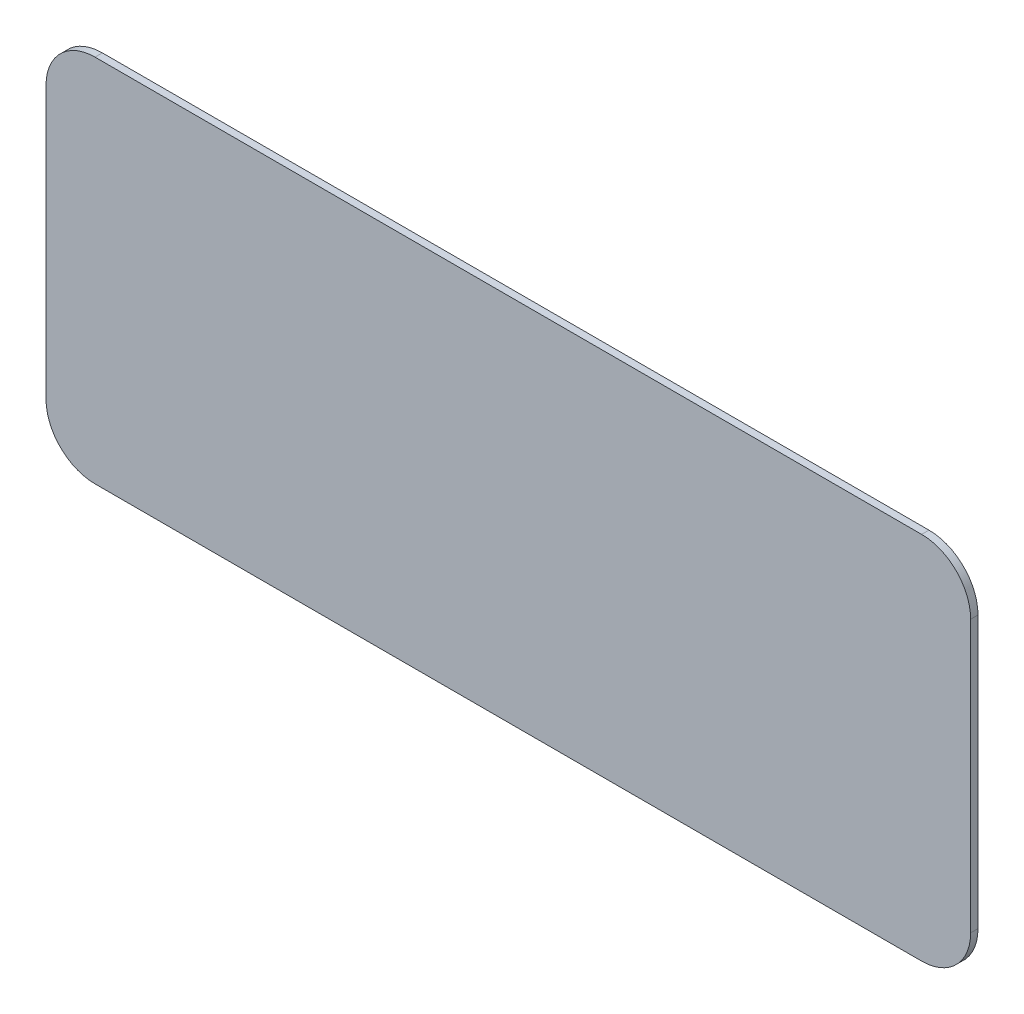
ISO-10303-21;
HEADER;
FILE_DESCRIPTION(('STEP AP214'),'2;1');
FILE_NAME('part.step','',(''),(''),'','','');
FILE_SCHEMA(('AUTOMOTIVE_DESIGN { 1 0 10303 214 1 1 1 1 }'));
ENDSEC;
DATA;
#1=APPLICATION_CONTEXT('core data for automotive mechanical design processes');
#2=APPLICATION_PROTOCOL_DEFINITION('international standard','automotive_design',2000,#1);
#3=PRODUCT_CONTEXT('',#1,'mechanical');
#4=PRODUCT('Part','Part','',(#3));
#5=PRODUCT_RELATED_PRODUCT_CATEGORY('part','',(#4));
#6=PRODUCT_DEFINITION_FORMATION('','',#4);
#7=PRODUCT_DEFINITION_CONTEXT('part definition',#1,'design');
#8=PRODUCT_DEFINITION('design','',#6,#7);
#9=PRODUCT_DEFINITION_SHAPE('','',#8);
#10=(LENGTH_UNIT() NAMED_UNIT(*) SI_UNIT(.MILLI.,.METRE.));
#11=(NAMED_UNIT(*) PLANE_ANGLE_UNIT() SI_UNIT($,.RADIAN.));
#12=(NAMED_UNIT(*) SI_UNIT($,.STERADIAN.) SOLID_ANGLE_UNIT());
#13=UNCERTAINTY_MEASURE_WITH_UNIT(LENGTH_MEASURE(1.E-05),#10,'distance_accuracy_value','');
#14=(GEOMETRIC_REPRESENTATION_CONTEXT(3) GLOBAL_UNCERTAINTY_ASSIGNED_CONTEXT((#13)) GLOBAL_UNIT_ASSIGNED_CONTEXT((#10,
#11,#12)) REPRESENTATION_CONTEXT('',''));
#15=CARTESIAN_POINT('',(0.,0.,0.));
#16=DIRECTION('',(0.,0.,1.));
#17=DIRECTION('',(1.,0.,0.));
#18=AXIS2_PLACEMENT_3D('',#15,#16,#17);
#19=CARTESIAN_POINT('',(74.93,110.871,3.));
#20=DIRECTION('',(0.,0.,-1.));
#21=DIRECTION('',(-1.,0.,0.));
#22=AXIS2_PLACEMENT_3D('',#19,#20,#21);
#23=CYLINDRICAL_SURFACE('',#22,20.);
#24=CARTESIAN_POINT('',(74.93,110.871,0.));
#25=DIRECTION('',(0.,0.,1.));
#26=DIRECTION('',(1.,0.,0.));
#27=AXIS2_PLACEMENT_3D('',#24,#25,#26);
#28=CIRCLE('',#27,20.);
#29=CARTESIAN_POINT('',(94.93,110.871,0.));
#30=VERTEX_POINT('',#29);
#31=CARTESIAN_POINT('',(74.9299999999999,130.871,0.));
#32=VERTEX_POINT('',#31);
#33=EDGE_CURVE('E128',#30,#32,#28,.T.);
#34=ORIENTED_EDGE('',*,*,#33,.T.);
#35=DIRECTION('',(0.,0.,-1.));
#36=VECTOR('',#35,1.);
#37=CARTESIAN_POINT('',(74.9299999999999,130.871,3.));
#38=LINE('',#37,#36);
#39=CARTESIAN_POINT('',(74.9299999999999,130.871,3.));
#40=VERTEX_POINT('',#39);
#41=EDGE_CURVE('E11',#40,#32,#38,.T.);
#42=ORIENTED_EDGE('',*,*,#41,.F.);
#43=CARTESIAN_POINT('',(74.93,110.871,3.));
#44=DIRECTION('',(0.,0.,1.));
#45=DIRECTION('',(1.,0.,0.));
#46=AXIS2_PLACEMENT_3D('',#43,#44,#45);
#47=CIRCLE('',#46,20.);
#48=CARTESIAN_POINT('',(94.93,110.871,3.));
#49=VERTEX_POINT('',#48);
#50=EDGE_CURVE('E142',#49,#40,#47,.T.);
#51=ORIENTED_EDGE('',*,*,#50,.F.);
#52=DIRECTION('',(0.,0.,-1.));
#53=VECTOR('',#52,1.);
#54=CARTESIAN_POINT('',(94.93,110.871,3.));
#55=LINE('',#54,#53);
#56=EDGE_CURVE('E124',#49,#30,#55,.T.);
#57=ORIENTED_EDGE('',*,*,#56,.T.);
#58=EDGE_LOOP('',(#34,#42,#51,#57));
#59=FACE_BOUND('',#58,.T.);
#60=ADVANCED_FACE('F32',(#59),#23,.T.);
#61=CARTESIAN_POINT('',(74.9299999999999,130.871,3.));
#62=DIRECTION('',(0.,-1.,0.));
#63=DIRECTION('',(0.,0.,-1.));
#64=AXIS2_PLACEMENT_3D('',#61,#62,#63);
#65=PLANE('',#64);
#66=DIRECTION('',(-1.,0.,0.));
#67=VECTOR('',#66,1.);
#68=CARTESIAN_POINT('',(74.9299999999999,130.871,0.));
#69=LINE('',#68,#67);
#70=CARTESIAN_POINT('',(-262.531032337169,130.871,0.));
#71=VERTEX_POINT('',#70);
#72=EDGE_CURVE('E131',#32,#71,#69,.T.);
#73=ORIENTED_EDGE('',*,*,#72,.T.);
#74=DIRECTION('',(0.,0.,-1.));
#75=VECTOR('',#74,1.);
#76=CARTESIAN_POINT('',(-262.531032337169,130.871,3.));
#77=LINE('',#76,#75);
#78=CARTESIAN_POINT('',(-262.531032337169,130.871,3.));
#79=VERTEX_POINT('',#78);
#80=EDGE_CURVE('E40',#79,#71,#77,.T.);
#81=ORIENTED_EDGE('',*,*,#80,.F.);
#82=DIRECTION('',(-1.,0.,0.));
#83=VECTOR('',#82,1.);
#84=CARTESIAN_POINT('',(74.9299999999999,130.871,3.));
#85=LINE('',#84,#83);
#86=EDGE_CURVE('E91',#40,#79,#85,.T.);
#87=ORIENTED_EDGE('',*,*,#86,.F.);
#88=ORIENTED_EDGE('',*,*,#41,.T.);
#89=EDGE_LOOP('',(#73,#81,#87,#88));
#90=FACE_BOUND('',#89,.T.);
#91=ADVANCED_FACE('F177',(#90),#65,.F.);
#92=CARTESIAN_POINT('',(-262.531032337169,110.871,3.));
#93=DIRECTION('',(0.,0.,-1.));
#94=DIRECTION('',(-1.,0.,0.));
#95=AXIS2_PLACEMENT_3D('',#92,#93,#94);
#96=CYLINDRICAL_SURFACE('',#95,20.);
#97=CARTESIAN_POINT('',(-262.531032337169,110.871,0.));
#98=DIRECTION('',(0.,0.,1.));
#99=DIRECTION('',(1.,0.,0.));
#100=AXIS2_PLACEMENT_3D('',#97,#98,#99);
#101=CIRCLE('',#100,20.);
#102=CARTESIAN_POINT('',(-282.531032337169,110.871,0.));
#103=VERTEX_POINT('',#102);
#104=EDGE_CURVE('E133',#71,#103,#101,.T.);
#105=ORIENTED_EDGE('',*,*,#104,.T.);
#106=DIRECTION('',(0.,0.,-1.));
#107=VECTOR('',#106,1.);
#108=CARTESIAN_POINT('',(-282.531032337169,110.871,3.));
#109=LINE('',#108,#107);
#110=CARTESIAN_POINT('',(-282.531032337169,110.871,3.));
#111=VERTEX_POINT('',#110);
#112=EDGE_CURVE('E149',#111,#103,#109,.T.);
#113=ORIENTED_EDGE('',*,*,#112,.F.);
#114=CARTESIAN_POINT('',(-262.531032337169,110.871,3.));
#115=DIRECTION('',(0.,0.,1.));
#116=DIRECTION('',(1.,0.,0.));
#117=AXIS2_PLACEMENT_3D('',#114,#115,#116);
#118=CIRCLE('',#117,20.);
#119=EDGE_CURVE('E157',#79,#111,#118,.T.);
#120=ORIENTED_EDGE('',*,*,#119,.F.);
#121=ORIENTED_EDGE('',*,*,#80,.T.);
#122=EDGE_LOOP('',(#105,#113,#120,#121));
#123=FACE_BOUND('',#122,.T.);
#124=ADVANCED_FACE('F155',(#123),#96,.T.);
#125=CARTESIAN_POINT('',(-282.531032337169,110.871,3.));
#126=DIRECTION('',(1.,0.,0.));
#127=DIRECTION('',(0.,0.,-1.));
#128=AXIS2_PLACEMENT_3D('',#125,#126,#127);
#129=PLANE('',#128);
#130=DIRECTION('',(0.,-1.,0.));
#131=VECTOR('',#130,1.);
#132=CARTESIAN_POINT('',(-282.531032337169,110.871,0.));
#133=LINE('',#132,#131);
#134=CARTESIAN_POINT('',(-282.531032337169,0.,0.));
#135=VERTEX_POINT('',#134);
#136=EDGE_CURVE('E135',#103,#135,#133,.T.);
#137=ORIENTED_EDGE('',*,*,#136,.T.);
#138=DIRECTION('',(0.,0.,-1.));
#139=VECTOR('',#138,1.);
#140=CARTESIAN_POINT('',(-282.531032337169,0.,3.));
#141=LINE('',#140,#139);
#142=CARTESIAN_POINT('',(-282.531032337169,0.,3.));
#143=VERTEX_POINT('',#142);
#144=EDGE_CURVE('E146',#143,#135,#141,.T.);
#145=ORIENTED_EDGE('',*,*,#144,.F.);
#146=DIRECTION('',(0.,-1.,0.));
#147=VECTOR('',#146,1.);
#148=CARTESIAN_POINT('',(-282.531032337169,110.871,3.));
#149=LINE('',#148,#147);
#150=EDGE_CURVE('E169',#111,#143,#149,.T.);
#151=ORIENTED_EDGE('',*,*,#150,.F.);
#152=ORIENTED_EDGE('',*,*,#112,.T.);
#153=EDGE_LOOP('',(#137,#145,#151,#152));
#154=FACE_BOUND('',#153,.T.);
#155=ADVANCED_FACE('F165',(#154),#129,.F.);
#156=CARTESIAN_POINT('',(-262.531032337169,0.,3.));
#157=DIRECTION('',(0.,0.,-1.));
#158=DIRECTION('',(-1.,0.,0.));
#159=AXIS2_PLACEMENT_3D('',#156,#157,#158);
#160=CYLINDRICAL_SURFACE('',#159,20.);
#161=CARTESIAN_POINT('',(-262.531032337169,0.,0.));
#162=DIRECTION('',(0.,0.,1.));
#163=DIRECTION('',(1.,0.,0.));
#164=AXIS2_PLACEMENT_3D('',#161,#162,#163);
#165=CIRCLE('',#164,20.);
#166=CARTESIAN_POINT('',(-262.531032337169,-20.,0.));
#167=VERTEX_POINT('',#166);
#168=EDGE_CURVE('E137',#135,#167,#165,.T.);
#169=ORIENTED_EDGE('',*,*,#168,.T.);
#170=DIRECTION('',(0.,0.,-1.));
#171=VECTOR('',#170,1.);
#172=CARTESIAN_POINT('',(-262.531032337169,-20.,3.));
#173=LINE('',#172,#171);
#174=CARTESIAN_POINT('',(-262.531032337169,-20.,3.));
#175=VERTEX_POINT('',#174);
#176=EDGE_CURVE('E119',#175,#167,#173,.T.);
#177=ORIENTED_EDGE('',*,*,#176,.F.);
#178=CARTESIAN_POINT('',(-262.531032337169,0.,3.));
#179=DIRECTION('',(0.,0.,1.));
#180=DIRECTION('',(1.,0.,0.));
#181=AXIS2_PLACEMENT_3D('',#178,#179,#180);
#182=CIRCLE('',#181,20.);
#183=EDGE_CURVE('E110',#143,#175,#182,.T.);
#184=ORIENTED_EDGE('',*,*,#183,.F.);
#185=ORIENTED_EDGE('',*,*,#144,.T.);
#186=EDGE_LOOP('',(#169,#177,#184,#185));
#187=FACE_BOUND('',#186,.T.);
#188=ADVANCED_FACE('F168',(#187),#160,.T.);
#189=CARTESIAN_POINT('',(-262.531032337169,-20.,3.));
#190=DIRECTION('',(0.,1.,0.));
#191=DIRECTION('',(-1.,0.,0.));
#192=AXIS2_PLACEMENT_3D('',#189,#190,#191);
#193=PLANE('',#192);
#194=DIRECTION('',(1.,0.,0.));
#195=VECTOR('',#194,1.);
#196=CARTESIAN_POINT('',(-262.531032337169,-20.,0.));
#197=LINE('',#196,#195);
#198=CARTESIAN_POINT('',(74.9299999999999,-20.,0.));
#199=VERTEX_POINT('',#198);
#200=EDGE_CURVE('E118',#167,#199,#197,.T.);
#201=ORIENTED_EDGE('',*,*,#200,.T.);
#202=DIRECTION('',(0.,0.,-1.));
#203=VECTOR('',#202,1.);
#204=CARTESIAN_POINT('',(74.9299999999999,-20.,3.));
#205=LINE('',#204,#203);
#206=CARTESIAN_POINT('',(74.9299999999999,-20.,3.));
#207=VERTEX_POINT('',#206);
#208=EDGE_CURVE('E115',#207,#199,#205,.T.);
#209=ORIENTED_EDGE('',*,*,#208,.F.);
#210=DIRECTION('',(1.,0.,0.));
#211=VECTOR('',#210,1.);
#212=CARTESIAN_POINT('',(-262.531032337169,-20.,3.));
#213=LINE('',#212,#211);
#214=EDGE_CURVE('E104',#175,#207,#213,.T.);
#215=ORIENTED_EDGE('',*,*,#214,.F.);
#216=ORIENTED_EDGE('',*,*,#176,.T.);
#217=EDGE_LOOP('',(#201,#209,#215,#216));
#218=FACE_BOUND('',#217,.T.);
#219=ADVANCED_FACE('F116',(#218),#193,.F.);
#220=CARTESIAN_POINT('',(74.93,0.,3.));
#221=DIRECTION('',(0.,0.,-1.));
#222=DIRECTION('',(-1.,0.,0.));
#223=AXIS2_PLACEMENT_3D('',#220,#221,#222);
#224=CYLINDRICAL_SURFACE('',#223,20.);
#225=CARTESIAN_POINT('',(74.93,0.,0.));
#226=DIRECTION('',(0.,0.,1.));
#227=DIRECTION('',(1.,0.,0.));
#228=AXIS2_PLACEMENT_3D('',#225,#226,#227);
#229=CIRCLE('',#228,20.);
#230=CARTESIAN_POINT('',(94.93,1.42247325030098E-13,0.));
#231=VERTEX_POINT('',#230);
#232=EDGE_CURVE('E77',#199,#231,#229,.T.);
#233=ORIENTED_EDGE('',*,*,#232,.T.);
#234=DIRECTION('',(0.,0.,-1.));
#235=VECTOR('',#234,1.);
#236=CARTESIAN_POINT('',(94.93,1.42247325030098E-13,3.));
#237=LINE('',#236,#235);
#238=CARTESIAN_POINT('',(94.93,1.42247325030098E-13,3.));
#239=VERTEX_POINT('',#238);
#240=EDGE_CURVE('E120',#239,#231,#237,.T.);
#241=ORIENTED_EDGE('',*,*,#240,.F.);
#242=CARTESIAN_POINT('',(74.93,0.,3.));
#243=DIRECTION('',(0.,0.,1.));
#244=DIRECTION('',(1.,0.,0.));
#245=AXIS2_PLACEMENT_3D('',#242,#243,#244);
#246=CIRCLE('',#245,20.);
#247=EDGE_CURVE('E108',#207,#239,#246,.T.);
#248=ORIENTED_EDGE('',*,*,#247,.F.);
#249=ORIENTED_EDGE('',*,*,#208,.T.);
#250=EDGE_LOOP('',(#233,#241,#248,#249));
#251=FACE_BOUND('',#250,.T.);
#252=ADVANCED_FACE('F122',(#251),#224,.T.);
#253=CARTESIAN_POINT('',(94.93,1.42247325030098E-13,3.));
#254=DIRECTION('',(-1.,0.,0.));
#255=DIRECTION('',(0.,0.,1.));
#256=AXIS2_PLACEMENT_3D('',#253,#254,#255);
#257=PLANE('',#256);
#258=DIRECTION('',(0.,1.,0.));
#259=VECTOR('',#258,1.);
#260=CARTESIAN_POINT('',(94.93,1.42247325030098E-13,0.));
#261=LINE('',#260,#259);
#262=EDGE_CURVE('E83',#231,#30,#261,.T.);
#263=ORIENTED_EDGE('',*,*,#262,.T.);
#264=ORIENTED_EDGE('',*,*,#56,.F.);
#265=DIRECTION('',(0.,1.,0.));
#266=VECTOR('',#265,1.);
#267=CARTESIAN_POINT('',(94.93,1.42247325030098E-13,3.));
#268=LINE('',#267,#266);
#269=EDGE_CURVE('E48',#239,#49,#268,.T.);
#270=ORIENTED_EDGE('',*,*,#269,.F.);
#271=ORIENTED_EDGE('',*,*,#240,.T.);
#272=EDGE_LOOP('',(#263,#264,#270,#271));
#273=FACE_BOUND('',#272,.T.);
#274=ADVANCED_FACE('F193',(#273),#257,.F.);
#275=CARTESIAN_POINT('',(74.93,110.871,3.));
#276=DIRECTION('',(0.,0.,1.));
#277=DIRECTION('',(1.,0.,0.));
#278=AXIS2_PLACEMENT_3D('',#275,#276,#277);
#279=PLANE('',#278);
#280=ORIENTED_EDGE('',*,*,#50,.T.);
#281=ORIENTED_EDGE('',*,*,#86,.T.);
#282=ORIENTED_EDGE('',*,*,#119,.T.);
#283=ORIENTED_EDGE('',*,*,#150,.T.);
#284=ORIENTED_EDGE('',*,*,#183,.T.);
#285=ORIENTED_EDGE('',*,*,#214,.T.);
#286=ORIENTED_EDGE('',*,*,#247,.T.);
#287=ORIENTED_EDGE('',*,*,#269,.T.);
#288=EDGE_LOOP('',(#280,#281,#282,#283,#284,#285,#286,#287));
#289=FACE_BOUND('',#288,.T.);
#290=ADVANCED_FACE('F106',(#289),#279,.T.);
#291=CARTESIAN_POINT('',(74.93,110.871,0.));
#292=DIRECTION('',(0.,0.,1.));
#293=DIRECTION('',(1.,0.,0.));
#294=AXIS2_PLACEMENT_3D('',#291,#292,#293);
#295=PLANE('',#294);
#296=ORIENTED_EDGE('',*,*,#33,.F.);
#297=ORIENTED_EDGE('',*,*,#262,.F.);
#298=ORIENTED_EDGE('',*,*,#232,.F.);
#299=ORIENTED_EDGE('',*,*,#200,.F.);
#300=ORIENTED_EDGE('',*,*,#168,.F.);
#301=ORIENTED_EDGE('',*,*,#136,.F.);
#302=ORIENTED_EDGE('',*,*,#104,.F.);
#303=ORIENTED_EDGE('',*,*,#72,.F.);
#304=EDGE_LOOP('',(#296,#297,#298,#299,#300,#301,#302,#303));
#305=FACE_BOUND('',#304,.T.);
#306=ADVANCED_FACE('F161',(#305),#295,.F.);
#307=CLOSED_SHELL('',(#60,#91,#124,#155,#188,#219,#252,#274,#290,#306));
#308=MANIFOLD_SOLID_BREP('B2',#307);
#309=ADVANCED_BREP_SHAPE_REPRESENTATION('',(#18,#308),#14);
#310=SHAPE_DEFINITION_REPRESENTATION(#9,#309);
ENDSEC;
END-ISO-10303-21;
